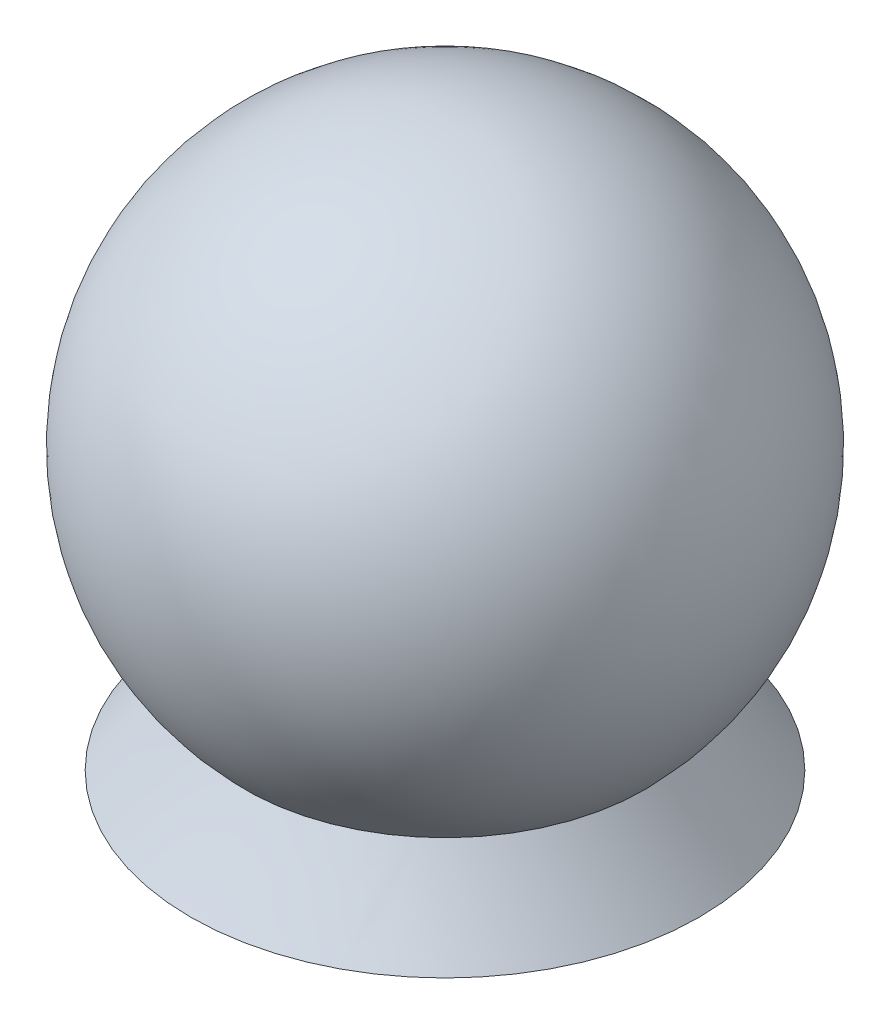
ISO-10303-21;
HEADER;
FILE_DESCRIPTION(('STEP AP214'),'2;1');
FILE_NAME('part.step','',(''),(''),'','','');
FILE_SCHEMA(('AUTOMOTIVE_DESIGN { 1 0 10303 214 1 1 1 1 }'));
ENDSEC;
DATA;
#1=APPLICATION_CONTEXT('core data for automotive mechanical design processes');
#2=APPLICATION_PROTOCOL_DEFINITION('international standard','automotive_design',2000,#1);
#3=PRODUCT_CONTEXT('',#1,'mechanical');
#4=PRODUCT('Part','Part','',(#3));
#5=PRODUCT_RELATED_PRODUCT_CATEGORY('part','',(#4));
#6=PRODUCT_DEFINITION_FORMATION('','',#4);
#7=PRODUCT_DEFINITION_CONTEXT('part definition',#1,'design');
#8=PRODUCT_DEFINITION('design','',#6,#7);
#9=PRODUCT_DEFINITION_SHAPE('','',#8);
#10=(LENGTH_UNIT() NAMED_UNIT(*) SI_UNIT(.MILLI.,.METRE.));
#11=(NAMED_UNIT(*) PLANE_ANGLE_UNIT() SI_UNIT($,.RADIAN.));
#12=(NAMED_UNIT(*) SI_UNIT($,.STERADIAN.) SOLID_ANGLE_UNIT());
#13=UNCERTAINTY_MEASURE_WITH_UNIT(LENGTH_MEASURE(1.E-05),#10,'distance_accuracy_value','');
#14=(GEOMETRIC_REPRESENTATION_CONTEXT(3) GLOBAL_UNCERTAINTY_ASSIGNED_CONTEXT((#13)) GLOBAL_UNIT_ASSIGNED_CONTEXT((#10,
#11,#12)) REPRESENTATION_CONTEXT('',''));
#15=CARTESIAN_POINT('',(0.,0.,0.));
#16=DIRECTION('',(0.,0.,1.));
#17=DIRECTION('',(1.,0.,0.));
#18=AXIS2_PLACEMENT_3D('',#15,#16,#17);
#19=CARTESIAN_POINT('',(0.,2.21594157997507,0.));
#20=DIRECTION('',(0.,-1.,0.));
#21=DIRECTION('',(-1.,0.,0.));
#22=AXIS2_PLACEMENT_3D('',#19,#20,#21);
#23=SPHERICAL_SURFACE('',#22,2.21594157997507);
#24=CARTESIAN_POINT('',(0.,0.646700664735532,0.));
#25=DIRECTION('',(0.,1.,0.));
#26=DIRECTION('',(0.,0.,1.));
#27=AXIS2_PLACEMENT_3D('',#24,#25,#26);
#28=CIRCLE('',#27,1.56457023997026);
#29=CARTESIAN_POINT('',(0.996628487099688,0.646700664735532,1.20607283963365));
#30=VERTEX_POINT('',#29);
#31=EDGE_CURVE('E50',#30,#30,#28,.F.);
#32=ORIENTED_EDGE('',*,*,#31,.F.);
#33=EDGE_LOOP('',(#32));
#34=FACE_BOUND('',#33,.T.);
#35=ADVANCED_FACE('F43',(#34),#23,.T.);
#36=CARTESIAN_POINT('',(0.942516398285374,0.,1.7639906005881));
#37=CARTESIAN_POINT('',(1.02619048703313,1.,0.901276533048657));
#38=CARTESIAN_POINT('',(4.47049759946157,0.,-0.121042195982649));
#39=CARTESIAN_POINT('',(2.82874355313044,1.,-1.1511044410176));
#40=CARTESIAN_POINT('',(2.58546480289083,0.,-3.64902339715885));
#41=CARTESIAN_POINT('',(0.776362579064184,1.,-2.95365750711492));
#42=CARTESIAN_POINT('',(-0.942516398285374,0.,-1.7639906005881));
#43=CARTESIAN_POINT('',(-1.02619048703313,1.,-0.901276533048657));
#44=CARTESIAN_POINT('',(-4.47049759946157,0.,0.121042195982647));
#45=CARTESIAN_POINT('',(-2.82874355313044,1.,1.1511044410176));
#46=CARTESIAN_POINT('',(-2.58546480289083,0.,3.64902339715885));
#47=CARTESIAN_POINT('',(-0.776362579064184,1.,2.95365750711492));
#48=CARTESIAN_POINT('',(0.942516398285374,0.,1.7639906005881));
#49=CARTESIAN_POINT('',(1.02619048703313,1.,0.901276533048657));
#50=(BOUNDED_SURFACE() B_SPLINE_SURFACE(3,1,((#36,#37),(#38,#39),(#40,#41),(#42,#43),(#44,#45),
(#46,#47),(#48,#49)),.UNSPECIFIED.,.T.,.F.,.F.) B_SPLINE_SURFACE_WITH_KNOTS((4,3,4),(2,2),(0.,
0.5,1.),(0.,1.),.UNSPECIFIED.) GEOMETRIC_REPRESENTATION_ITEM() RATIONAL_B_SPLINE_SURFACE(((1.,
1.),(0.333333333333333,0.333333333333333),(0.333333333333333,0.333333333333333),(1.,1.),
(0.333333333333333,0.333333333333333),(0.333333333333333,0.333333333333333),(1.,1.))) REPRESENTATION_ITEM('') SURFACE());
#51=CARTESIAN_POINT('',(0.,0.,0.));
#52=DIRECTION('',(0.,1.,0.));
#53=DIRECTION('',(0.,0.,1.));
#54=AXIS2_PLACEMENT_3D('',#51,#52,#53);
#55=CIRCLE('',#54,2.);
#56=CARTESIAN_POINT('',(0.942516398285374,0.,1.7639906005881));
#57=VERTEX_POINT('',#56);
#58=EDGE_CURVE('E12',#57,#57,#55,.T.);
#59=CARTESIAN_POINT('',(0.942516398285374,0.,1.7639906005881));
#60=CARTESIAN_POINT('',(0.94308006587719,0.00673646525766186,1.75817895724482));
#61=CARTESIAN_POINT('',(0.943643733469006,0.0134729305153236,1.75236731390155));
#62=CARTESIAN_POINT('',(0.944771068652638,0.0269458610306472,1.740744027215));
#63=CARTESIAN_POINT('',(0.945334736244453,0.0336823262883089,1.73493238387172));
#64=CARTESIAN_POINT('',(0.946462071428085,0.0471552568036325,1.72330909718517));
#65=CARTESIAN_POINT('',(0.947025739019901,0.0538917220612944,1.7174974538419));
#66=CARTESIAN_POINT('',(0.948153074203532,0.0673646525766179,1.70587416715534));
#67=CARTESIAN_POINT('',(0.948716741795348,0.0741011178342797,1.70006252381207));
#68=CARTESIAN_POINT('',(0.949844076978979,0.0875740483496033,1.68843923712552));
#69=CARTESIAN_POINT('',(0.950407744570795,0.0943105136072652,1.68262759378224));
#70=CARTESIAN_POINT('',(0.951535079754427,0.107783444122589,1.67100430709569));
#71=CARTESIAN_POINT('',(0.952098747346242,0.11451990938025,1.66519266375242));
#72=CARTESIAN_POINT('',(0.953226082529874,0.127992839895574,1.65356937706586));
#73=CARTESIAN_POINT('',(0.95378975012169,0.134729305153236,1.64775773372259));
#74=CARTESIAN_POINT('',(0.954917085305321,0.148202235668559,1.63613444703604));
#75=CARTESIAN_POINT('',(0.955480752897137,0.154938700926221,1.63032280369276));
#76=CARTESIAN_POINT('',(0.956608088080769,0.168411631441545,1.61869951700621));
#77=CARTESIAN_POINT('',(0.957171755672584,0.175148096699207,1.61288787366294));
#78=CARTESIAN_POINT('',(0.958299090856216,0.18862102721453,1.60126458697638));
#79=CARTESIAN_POINT('',(0.958862758448032,0.195357492472192,1.59545294363311));
#80=CARTESIAN_POINT('',(0.959990093631663,0.208830422987516,1.58382965694656));
#81=CARTESIAN_POINT('',(0.960553761223479,0.215566888245177,1.57801801360328));
#82=CARTESIAN_POINT('',(0.961681096407111,0.229039818760501,1.56639472691673));
#83=CARTESIAN_POINT('',(0.962244763998926,0.235776284018163,1.56058308357346));
#84=CARTESIAN_POINT('',(0.963372099182558,0.249249214533486,1.5489597968869));
#85=CARTESIAN_POINT('',(0.963935766774374,0.255985679791148,1.54314815354363));
#86=CARTESIAN_POINT('',(0.965063101958005,0.269458610306472,1.53152486685708));
#87=CARTESIAN_POINT('',(0.965626769549821,0.276195075564134,1.5257132235138));
#88=CARTESIAN_POINT('',(0.966754104733452,0.289668006079457,1.51408993682725));
#89=CARTESIAN_POINT('',(0.967317772325268,0.296404471337119,1.50827829348398));
#90=CARTESIAN_POINT('',(0.9684451075089,0.309877401852443,1.49665500679742));
#91=CARTESIAN_POINT('',(0.969008775100716,0.316613867110104,1.49084336345415));
#92=CARTESIAN_POINT('',(0.970136110284347,0.330086797625428,1.4792200767676));
#93=CARTESIAN_POINT('',(0.970699777876163,0.33682326288309,1.47340843342432));
#94=CARTESIAN_POINT('',(0.971827113059795,0.350296193398413,1.46178514673777));
#95=CARTESIAN_POINT('',(0.97239078065161,0.357032658656075,1.4559735033945));
#96=CARTESIAN_POINT('',(0.973518115835242,0.370505589171399,1.44435021670794));
#97=CARTESIAN_POINT('',(0.974081783427058,0.37724205442906,1.43853857336467));
#98=CARTESIAN_POINT('',(0.975209118610689,0.390714984944384,1.42691528667812));
#99=CARTESIAN_POINT('',(0.975772786202505,0.397451450202046,1.42110364333484));
#100=CARTESIAN_POINT('',(0.976900121386136,0.410924380717369,1.40948035664829));
#101=CARTESIAN_POINT('',(0.977463788977952,0.417660845975031,1.40366871330502));
#102=CARTESIAN_POINT('',(0.978591124161584,0.431133776490355,1.39204542661846));
#103=CARTESIAN_POINT('',(0.979154791753399,0.437870241748017,1.38623378327519));
#104=CARTESIAN_POINT('',(0.980282126937031,0.45134317226334,1.37461049658864));
#105=CARTESIAN_POINT('',(0.980845794528846,0.458079637521002,1.36879885324536));
#106=CARTESIAN_POINT('',(0.981973129712478,0.471552568036326,1.35717556655881));
#107=CARTESIAN_POINT('',(0.982536797304294,0.478289033293987,1.35136392321554));
#108=CARTESIAN_POINT('',(0.983664132487926,0.491761963809311,1.33974063652899));
#109=CARTESIAN_POINT('',(0.984227800079741,0.498498429066973,1.33392899318571));
#110=CARTESIAN_POINT('',(0.985355135263373,0.511971359582296,1.32230570649916));
#111=CARTESIAN_POINT('',(0.985918802855189,0.518707824839958,1.31649406315588));
#112=CARTESIAN_POINT('',(0.98704613803882,0.532180755355282,1.30487077646933));
#113=CARTESIAN_POINT('',(0.987609805630636,0.538917220612944,1.29905913312606));
#114=CARTESIAN_POINT('',(0.988737140814268,0.552390151128267,1.28743584643951));
#115=CARTESIAN_POINT('',(0.989300808406083,0.559126616385929,1.28162420309623));
#116=CARTESIAN_POINT('',(0.990428143589715,0.572599546901252,1.27000091640968));
#117=CARTESIAN_POINT('',(0.990991811181531,0.579336012158914,1.2641892730664));
#118=CARTESIAN_POINT('',(0.992119146365162,0.592808942674238,1.25256598637985));
#119=CARTESIAN_POINT('',(0.992682813956978,0.5995454079319,1.24675434303658));
#120=CARTESIAN_POINT('',(0.993810149140609,0.613018338447223,1.23513105635003));
#121=CARTESIAN_POINT('',(0.994373816732425,0.619754803704885,1.22931941300675));
#122=CARTESIAN_POINT('',(0.995501151916057,0.633227734220209,1.2176961263202));
#123=CARTESIAN_POINT('',(0.996064819507872,0.63996419947787,1.21188448297692));
#124=CARTESIAN_POINT('',(0.996628487099688,0.646700664735532,1.20607283963365));
#125=B_SPLINE_CURVE_WITH_KNOTS('',3,(#59,#60,#61,#62,#63,#64,#65,#66,#67,#68,#69,#70,#71,#72,
#73,#74,#75,#76,#77,#78,#79,#80,#81,#82,#83,#84,#85,#86,#87,#88,#89,#90,#91,#92,#93,#94,#95,#96,
#97,#98,#99,#100,#101,#102,#103,#104,#105,#106,#107,#108,#109,#110,#111,#112,#113,#114,#115,
#116,#117,#118,#119,#120,#121,#122,#123,#124),.UNSPECIFIED.,.F.,.F.,(4,2,2,2,2,2,2,2,2,2,2,2,2,
2,2,2,2,2,2,2,2,2,2,2,2,2,2,2,2,2,2,2,4),(0.,0.0267442695364947,0.0534885390729895,
0.0802328086094842,0.106977078145979,0.133721347682474,0.160465617218968,0.187209886755463,
0.213954156291958,0.240698425828453,0.267442695364947,0.294186964901442,0.320931234437937,
0.347675503974432,0.374419773510926,0.401164043047421,0.427908312583916,0.45465258212041,
0.481396851656905,0.5081411211934,0.534885390729895,0.561629660266389,0.588373929802884,
0.615118199339379,0.641862468875874,0.668606738412369,0.695351007948863,0.722095277485358,
0.748839547021853,0.775583816558347,0.802328086094842,0.829072355631337,0.855816625167832),.UNSPECIFIED.);
#126=EDGE_CURVE('BSEAM45',#57,#30,#125,.T.);
#127=ORIENTED_EDGE('',*,*,#58,.T.);
#128=ORIENTED_EDGE('',*,*,#31,.T.);
#129=ORIENTED_EDGE('',*,*,#126,.T.);
#130=ORIENTED_EDGE('',*,*,#126,.F.);
#131=EDGE_LOOP('',(#127,#129,#128,#130));
#132=FACE_BOUND('',#131,.T.);
#133=ADVANCED_FACE('F45',(#132),#50,.T.);
#134=CARTESIAN_POINT('',(0.,0.,0.));
#135=DIRECTION('',(0.,1.,0.));
#136=DIRECTION('',(0.,0.,1.));
#137=AXIS2_PLACEMENT_3D('',#134,#135,#136);
#138=PLANE('',#137);
#139=CARTESIAN_POINT('',(0.,0.,0.));
#140=VERTEX_POINT('',#139);
#141=VERTEX_LOOP('',#140);
#142=FACE_BOUND('',#141,.T.);
#143=ORIENTED_EDGE('',*,*,#58,.F.);
#144=EDGE_LOOP('',(#143));
#145=FACE_BOUND('',#144,.T.);
#146=ADVANCED_FACE('F58',(#142,#145),#138,.F.);
#147=CLOSED_SHELL('',(#35,#133,#146));
#148=MANIFOLD_SOLID_BREP('B2',#147);
#149=ADVANCED_BREP_SHAPE_REPRESENTATION('',(#18,#148),#14);
#150=SHAPE_DEFINITION_REPRESENTATION(#9,#149);
ENDSEC;
END-ISO-10303-21;
